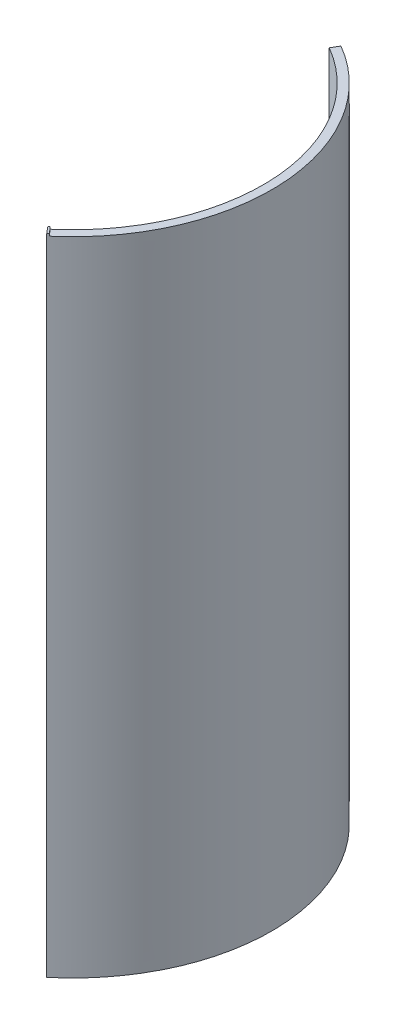
ISO-10303-21;
HEADER;
FILE_DESCRIPTION(('STEP AP214'),'2;1');
FILE_NAME('part.step','',(''),(''),'','','');
FILE_SCHEMA(('AUTOMOTIVE_DESIGN { 1 0 10303 214 1 1 1 1 }'));
ENDSEC;
DATA;
#1=APPLICATION_CONTEXT('core data for automotive mechanical design processes');
#2=APPLICATION_PROTOCOL_DEFINITION('international standard','automotive_design',2000,#1);
#3=PRODUCT_CONTEXT('',#1,'mechanical');
#4=PRODUCT('Part','Part','',(#3));
#5=PRODUCT_RELATED_PRODUCT_CATEGORY('part','',(#4));
#6=PRODUCT_DEFINITION_FORMATION('','',#4);
#7=PRODUCT_DEFINITION_CONTEXT('part definition',#1,'design');
#8=PRODUCT_DEFINITION('design','',#6,#7);
#9=PRODUCT_DEFINITION_SHAPE('','',#8);
#10=(LENGTH_UNIT() NAMED_UNIT(*) SI_UNIT(.MILLI.,.METRE.));
#11=(NAMED_UNIT(*) PLANE_ANGLE_UNIT() SI_UNIT($,.RADIAN.));
#12=(NAMED_UNIT(*) SI_UNIT($,.STERADIAN.) SOLID_ANGLE_UNIT());
#13=UNCERTAINTY_MEASURE_WITH_UNIT(LENGTH_MEASURE(1.E-05),#10,'distance_accuracy_value','');
#14=(GEOMETRIC_REPRESENTATION_CONTEXT(3) GLOBAL_UNCERTAINTY_ASSIGNED_CONTEXT((#13)) GLOBAL_UNIT_ASSIGNED_CONTEXT((#10,
#11,#12)) REPRESENTATION_CONTEXT('',''));
#15=CARTESIAN_POINT('',(0.,0.,0.));
#16=DIRECTION('',(0.,0.,1.));
#17=DIRECTION('',(1.,0.,0.));
#18=AXIS2_PLACEMENT_3D('',#15,#16,#17);
#19=CARTESIAN_POINT('',(0.,150.,0.));
#20=DIRECTION('',(0.,1.,0.));
#21=DIRECTION('',(0.,0.,1.));
#22=AXIS2_PLACEMENT_3D('',#19,#20,#21);
#23=PLANE('',#22);
#24=CARTESIAN_POINT('',(-19.0918830920365,150.,19.091883092037));
#25=CARTESIAN_POINT('',(-20.3463734071662,150.,18.1596419610419));
#26=CARTESIAN_POINT('',(-21.5345002593324,150.,17.1054336194398));
#27=CARTESIAN_POINT('',(-23.7328713875834,150.,14.7754464788285));
#28=CARTESIAN_POINT('',(-24.7430621891248,150.,13.4996862563432));
#29=CARTESIAN_POINT('',(-26.5442053629252,150.,10.7573847474911));
#30=CARTESIAN_POINT('',(-27.3351077383595,150.,9.2908719326232));
#31=CARTESIAN_POINT('',(-28.6617875844582,150.,6.20555601535264));
#32=CARTESIAN_POINT('',(-29.1975203590944,150.,4.58679060706874));
#33=CARTESIAN_POINT('',(-29.9848713551927,150.,1.24216620690554));
#34=CARTESIAN_POINT('',(-30.2364518716301,150.,-0.483646874587807));
#35=CARTESIAN_POINT('',(-30.4346480202212,150.,-3.99172231877559));
#36=CARTESIAN_POINT('',(-30.3812344349058,150.,-5.7739318685841));
#37=CARTESIAN_POINT('',(-29.9577408614613,150.,-9.34019463446037));
#38=CARTESIAN_POINT('',(-29.5876413908746,150.,-11.124189718761));
#39=CARTESIAN_POINT('',(-28.5289584697478,150.,-14.6371272504462));
#40=CARTESIAN_POINT('',(-27.8403662219906,150.,-16.3660080531824));
#41=CARTESIAN_POINT('',(-26.1531917269064,150.,-19.7113339535273));
#42=CARTESIAN_POINT('',(-25.1546119815376,150.,-21.3277158660333));
#43=CARTESIAN_POINT('',(-22.8663645263466,150.,-24.392054471337));
#44=CARTESIAN_POINT('',(-21.5767108667712,150.,-25.8399485147219));
#45=CARTESIAN_POINT('',(-18.7353780044284,150.,-28.5146111546944));
#46=CARTESIAN_POINT('',(-17.1837242676492,150.,-29.741319749938));
#47=CARTESIAN_POINT('',(-13.857020421084,150.,-31.9260486068176));
#48=CARTESIAN_POINT('',(-12.082006674444,150.,-32.8840135937121));
#49=CARTESIAN_POINT('',(-8.35584888350383,150.,-34.4905669189334));
#50=CARTESIAN_POINT('',(-6.40475120334752,150.,-35.1391066834268));
#51=CARTESIAN_POINT('',(-2.3810837423971,150.,-36.0945611631227));
#52=CARTESIAN_POINT('',(-0.308569074256293,150.,-36.401435807134));
#53=CARTESIAN_POINT('',(3.89740944185919,150.,-36.6510881068724));
#54=CARTESIAN_POINT('',(6.03081100392669,150.,-36.5938357592237));
#55=CARTESIAN_POINT('',(10.293943116198,150.,-36.1035956015378));
#56=CARTESIAN_POINT('',(12.4236060602799,150.,-35.6705891271213));
#57=CARTESIAN_POINT('',(16.6124993704204,150.,-34.428770402173));
#58=CARTESIAN_POINT('',(18.6716588858423,150.,-33.6199517546004));
#59=CARTESIAN_POINT('',(22.6527275815298,150.,-31.6383857424615));
#60=CARTESIAN_POINT('',(24.5745649013814,150.,-30.4656447952092));
#61=CARTESIAN_POINT('',(28.2162648147952,150.,-27.7800600744914));
#62=CARTESIAN_POINT('',(29.9360568617656,150.,-26.2672356717173));
#63=CARTESIAN_POINT('',(33.1131804789648,150.,-22.9368720843294));
#64=CARTESIAN_POINT('',(34.5704451543527,150.,-21.1193649410629));
#65=CARTESIAN_POINT('',(37.1683376924833,150.,-17.2258133701277));
#66=CARTESIAN_POINT('',(38.3089045878775,150.,-15.1498129498514));
#67=CARTESIAN_POINT('',(40.2274614116415,150.,-10.7950978751735));
#68=CARTESIAN_POINT('',(41.0053984376901,150.,-8.51643808142414));
#69=CARTESIAN_POINT('',(42.1627078141924,150.,-3.8203850911441));
#70=CARTESIAN_POINT('',(42.5420372536601,150.,-1.40305611494272));
#71=CARTESIAN_POINT('',(42.8775407157179,150.,3.49998905521581));
#72=CARTESIAN_POINT('',(42.8336834661649,150.,5.98563350315395));
#73=CARTESIAN_POINT('',(42.3107386888407,150.,10.9506450768701));
#74=CARTESIAN_POINT('',(41.8316328366593,150.,13.4299350530076));
#75=CARTESIAN_POINT('',(40.4393806043387,150.,18.3054968014477));
#76=CARTESIAN_POINT('',(39.5262297678277,150.,20.701688367873));
#77=CARTESIAN_POINT('',(37.280686855791,150.,25.3346058035535));
#78=CARTESIAN_POINT('',(35.9483046853433,150.,27.5712509120478));
#79=CARTESIAN_POINT('',(32.8926277115008,150.,31.8113457555537));
#80=CARTESIAN_POINT('',(31.1693572159586,150.,33.814716752477));
#81=CARTESIAN_POINT('',(27.3732480382687,150.,37.5196541469023));
#82=CARTESIAN_POINT('',(25.3004476449646,150.,39.2211464009758));
#83=CARTESIAN_POINT('',(20.8586979039303,150.,42.2611408054309));
#84=CARTESIAN_POINT('',(18.489799944907,150.,43.5995758902647));
#85=CARTESIAN_POINT('',(13.5200000313143,150.,45.8618219281404));
#86=CARTESIAN_POINT('',(10.9191612435361,150.,46.7855752060155));
#87=CARTESIAN_POINT('',(5.55862642549506,150.,48.1782550607997));
#88=CARTESIAN_POINT('',(2.79900361096261,150.,48.6471354166666));
#89=CARTESIAN_POINT('',(5.80617015949208E-13,150.,48.875));
#90=B_SPLINE_CURVE_WITH_KNOTS('',3,(#24,#25,#26,#27,#28,#29,#30,#31,#32,#33,#34,#35,#36,#37,#38,
#39,#40,#41,#42,#43,#44,#45,#46,#47,#48,#49,#50,#51,#52,#53,#54,#55,#56,#57,#58,#59,#60,#61,#62,
#63,#64,#65,#66,#67,#68,#69,#70,#71,#72,#73,#74,#75,#76,#77,#78,#79,#80,#81,#82,#83,#84,#85,#86,
#87,#88,#89),.UNSPECIFIED.,.F.,.F.,(4,2,2,2,2,2,2,2,2,2,2,2,2,2,2,2,2,2,2,2,2,2,2,2,2,2,2,2,2,2,
2,2,4),(0.,0.03125,0.0625,0.09375,0.125,0.15625,0.1875,0.21875,0.25,0.28125,0.3125,0.34375,
0.375,0.40625,0.4375,0.46875,0.5,0.53125,0.5625,0.59375,0.625,0.65625,0.6875,0.71875,0.75,
0.78125,0.8125,0.84375,0.875,0.90625,0.9375,0.96875,1.),.UNSPECIFIED.);
#91=CARTESIAN_POINT('',(22.7951421509959,150.,-31.4823443712795));
#92=VERTEX_POINT('',#91);
#93=CARTESIAN_POINT('',(26.9108133537189,150.,37.8162802669883));
#94=VERTEX_POINT('',#93);
#95=EDGE_CURVE('E98',#92,#94,#90,.T.);
#96=ORIENTED_EDGE('',*,*,#95,.T.);
#97=DIRECTION('',(0.647266097432394,0.,0.762264126871152));
#98=VECTOR('',#97,1.);
#99=CARTESIAN_POINT('',(-3.02165196939426,150.,2.56579420319399));
#100=LINE('',#99,#98);
#101=CARTESIAN_POINT('',(28.2053437399523,150.,39.3408063897618));
#102=VERTEX_POINT('',#101);
#103=EDGE_CURVE('E150',#94,#102,#100,.T.);
#104=ORIENTED_EDGE('',*,*,#103,.T.);
#105=CARTESIAN_POINT('',(-20.284806523139,150.,20.6971661473038));
#106=CARTESIAN_POINT('',(-21.6469349481276,150.,19.6849366161888));
#107=CARTESIAN_POINT('',(-24.1784754805348,150.,17.4351949136638));
#108=CARTESIAN_POINT('',(-28.5208644332071,150.,11.9579130722896));
#109=CARTESIAN_POINT('',(-32.149460613473,150.,3.60016921433298));
#110=CARTESIAN_POINT('',(-32.8348971371941,150.,-7.79353696689876));
#111=CARTESIAN_POINT('',(-29.4441518585612,150.,-19.1834580933702));
#112=CARTESIAN_POINT('',(-22.083640026458,150.,-29.1083698958214));
#113=CARTESIAN_POINT('',(-11.3826925533388,150.,-36.1844244603167));
#114=CARTESIAN_POINT('',(1.54976707172065,150.,-39.2970781470818));
#115=CARTESIAN_POINT('',(12.6426134399102,150.,-38.0545824427317));
#116=CARTESIAN_POINT('',(21.0330101055813,150.,-34.8691158336497));
#117=CARTESIAN_POINT('',(25.8635920265152,150.,-32.0782118074364));
#118=CARTESIAN_POINT('',(31.7987175405846,150.,-27.5199922653745));
#119=CARTESIAN_POINT('',(38.5761747844764,150.,-19.9889857519648));
#120=CARTESIAN_POINT('',(44.3682365957182,150.,-6.93710584227973));
#121=CARTESIAN_POINT('',(45.47844188482,150.,8.69346017968454));
#122=CARTESIAN_POINT('',(41.1214865583818,150.,24.1009158161417));
#123=CARTESIAN_POINT('',(34.3866469932016,150.,33.572491638163));
#124=CARTESIAN_POINT('',(28.9639981767198,150.,38.7297170698156));
#125=CARTESIAN_POINT('',(26.7177475938299,150.,40.6040404994617));
#126=CARTESIAN_POINT('',(22.6325811313915,150.,43.5587447934556));
#127=CARTESIAN_POINT('',(16.9541486744139,150.,46.7674378513083));
#128=CARTESIAN_POINT('',(10.1772840934641,150.,49.1736497511526));
#129=CARTESIAN_POINT('',(4.51546868359988,150.,50.3869026675537));
#130=CARTESIAN_POINT('',(1.61391719776806,150.,50.7502288372064));
#131=CARTESIAN_POINT('',(0.162281487584782,150.,50.8684053072036));
#132=B_SPLINE_CURVE_WITH_KNOTS('',3,(#105,#106,#107,#108,#109,#110,#111,#112,#113,#114,#115,
#116,#117,#118,#119,#120,#121,#122,#123,#124,#125,#126,#127,#128,#129,#130,#131),.UNSPECIFIED.,
.F.,.F.,(4,1,1,1,1,1,1,1,1,1,1,1,1,1,1,1,1,1,1,1,1,1,1,1,4),(0.,0.03125,0.0625,0.125,0.1875,
0.25,0.3125,0.375,0.4375,0.5,0.52693624887306,0.55818624887306,0.57381124887306,0.625,0.6875,
0.75,0.8125,0.873453421607825,0.881265921607825,0.896890921607825,0.90625,0.9375,0.96875,
0.984375,1.),.UNSPECIFIED.);
#133=CARTESIAN_POINT('',(23.7970623207433,150.,-33.2132851482714));
#134=VERTEX_POINT('',#133);
#135=EDGE_CURVE('E108',#134,#102,#132,.T.);
#136=ORIENTED_EDGE('',*,*,#135,.F.);
#137=DIRECTION('',(0.500960084873706,0.,-0.865470388495949));
#138=VECTOR('',#137,1.);
#139=CARTESIAN_POINT('',(3.4247724555705,150.,1.98236048606735));
#140=LINE('',#139,#138);
#141=EDGE_CURVE('E146',#92,#134,#140,.T.);
#142=ORIENTED_EDGE('',*,*,#141,.F.);
#143=EDGE_LOOP('',(#96,#104,#136,#142));
#144=FACE_BOUND('',#143,.T.);
#145=ADVANCED_FACE('F41',(#144),#23,.T.);
#146=DIRECTION('',(0.,-1.,0.));
#147=VECTOR('',#146,1.);
#148=SURFACE_OF_LINEAR_EXTRUSION('',#132,#147);
#149=CARTESIAN_POINT('',(-20.284806523139,0.,20.6971661473038));
#150=CARTESIAN_POINT('',(-21.6469349481276,0.,19.6849366161888));
#151=CARTESIAN_POINT('',(-24.1784754805348,0.,17.4351949136638));
#152=CARTESIAN_POINT('',(-28.5208644332071,0.,11.9579130722896));
#153=CARTESIAN_POINT('',(-32.149460613473,0.,3.60016921433298));
#154=CARTESIAN_POINT('',(-32.8348971371941,0.,-7.79353696689876));
#155=CARTESIAN_POINT('',(-29.4441518585612,0.,-19.1834580933702));
#156=CARTESIAN_POINT('',(-22.083640026458,0.,-29.1083698958214));
#157=CARTESIAN_POINT('',(-11.3826925533388,0.,-36.1844244603167));
#158=CARTESIAN_POINT('',(1.54976707172065,0.,-39.2970781470818));
#159=CARTESIAN_POINT('',(12.6426134399102,0.,-38.0545824427317));
#160=CARTESIAN_POINT('',(21.0330101055813,0.,-34.8691158336497));
#161=CARTESIAN_POINT('',(25.8635920265152,0.,-32.0782118074364));
#162=CARTESIAN_POINT('',(31.7987175405846,0.,-27.5199922653745));
#163=CARTESIAN_POINT('',(38.5761747844764,0.,-19.9889857519648));
#164=CARTESIAN_POINT('',(44.3682365957182,0.,-6.93710584227973));
#165=CARTESIAN_POINT('',(45.47844188482,0.,8.69346017968454));
#166=CARTESIAN_POINT('',(41.1214865583818,0.,24.1009158161417));
#167=CARTESIAN_POINT('',(34.3866469932016,0.,33.572491638163));
#168=CARTESIAN_POINT('',(28.9639981767198,0.,38.7297170698156));
#169=CARTESIAN_POINT('',(26.7177475938299,0.,40.6040404994617));
#170=CARTESIAN_POINT('',(22.6325811313915,0.,43.5587447934556));
#171=CARTESIAN_POINT('',(16.9541486744139,0.,46.7674378513083));
#172=CARTESIAN_POINT('',(10.1772840934641,0.,49.1736497511526));
#173=CARTESIAN_POINT('',(4.51546868359988,0.,50.3869026675537));
#174=CARTESIAN_POINT('',(1.61391719776806,0.,50.7502288372064));
#175=CARTESIAN_POINT('',(0.162281487584782,0.,50.8684053072036));
#176=B_SPLINE_CURVE_WITH_KNOTS('',3,(#149,#150,#151,#152,#153,#154,#155,#156,#157,#158,#159,
#160,#161,#162,#163,#164,#165,#166,#167,#168,#169,#170,#171,#172,#173,#174,#175),.UNSPECIFIED.,
.F.,.F.,(4,1,1,1,1,1,1,1,1,1,1,1,1,1,1,1,1,1,1,1,1,1,1,1,4),(0.,0.03125,0.0625,0.125,0.1875,
0.25,0.3125,0.375,0.4375,0.5,0.52693624887306,0.55818624887306,0.57381124887306,0.625,0.6875,
0.75,0.8125,0.873453421607825,0.881265921607825,0.896890921607825,0.90625,0.9375,0.96875,
0.984375,1.),.UNSPECIFIED.);
#177=CARTESIAN_POINT('',(23.7970623207433,0.,-33.2132851482714));
#178=VERTEX_POINT('',#177);
#179=CARTESIAN_POINT('',(27.8832469494637,0.,39.6119001683923));
#180=VERTEX_POINT('',#179);
#181=EDGE_CURVE('E88',#178,#180,#176,.T.);
#182=ORIENTED_EDGE('',*,*,#181,.F.);
#183=DIRECTION('',(0.,-1.,0.));
#184=VECTOR('',#183,1.);
#185=CARTESIAN_POINT('',(23.7970623207433,150.,-33.2132851482714));
#186=LINE('',#185,#184);
#187=EDGE_CURVE('E11',#134,#178,#186,.T.);
#188=ORIENTED_EDGE('',*,*,#187,.F.);
#189=ORIENTED_EDGE('',*,*,#135,.T.);
#190=DIRECTION('',(0.,-1.,0.));
#191=VECTOR('',#190,1.);
#192=CARTESIAN_POINT('',(28.2053437399522,150.5,39.3408063897618));
#193=LINE('',#192,#191);
#194=CARTESIAN_POINT('',(28.2053437399522,150.5,39.3408063897618));
#195=VERTEX_POINT('',#194);
#196=EDGE_CURVE('E58',#195,#102,#193,.T.);
#197=ORIENTED_EDGE('',*,*,#196,.F.);
#198=CARTESIAN_POINT('',(0.162281487584782,150.5,50.8684053072036));
#199=CARTESIAN_POINT('',(1.61391719776806,150.5,50.7502288372064));
#200=CARTESIAN_POINT('',(4.51546868359988,150.5,50.3869026675537));
#201=CARTESIAN_POINT('',(10.1772840934641,150.5,49.1736497511526));
#202=CARTESIAN_POINT('',(16.9541486744139,150.5,46.7674378513083));
#203=CARTESIAN_POINT('',(22.6325811313915,150.5,43.5587447934556));
#204=CARTESIAN_POINT('',(26.7177475938299,150.5,40.6040404994617));
#205=CARTESIAN_POINT('',(28.9639981767198,150.5,38.7297170698156));
#206=CARTESIAN_POINT('',(34.3866469932016,150.5,33.572491638163));
#207=CARTESIAN_POINT('',(41.1214865583818,150.5,24.1009158161417));
#208=CARTESIAN_POINT('',(45.47844188482,150.5,8.69346017968454));
#209=CARTESIAN_POINT('',(44.3682365957182,150.5,-6.93710584227973));
#210=CARTESIAN_POINT('',(38.5761747844764,150.5,-19.9889857519648));
#211=CARTESIAN_POINT('',(31.7987175405846,150.5,-27.5199922653745));
#212=CARTESIAN_POINT('',(25.8635920265152,150.5,-32.0782118074364));
#213=CARTESIAN_POINT('',(21.0330101055813,150.5,-34.8691158336497));
#214=CARTESIAN_POINT('',(12.6426134399102,150.5,-38.0545824427317));
#215=CARTESIAN_POINT('',(1.54976707172065,150.5,-39.2970781470818));
#216=CARTESIAN_POINT('',(-11.3826925533388,150.5,-36.1844244603167));
#217=CARTESIAN_POINT('',(-22.083640026458,150.5,-29.1083698958214));
#218=CARTESIAN_POINT('',(-29.4441518585612,150.5,-19.1834580933702));
#219=CARTESIAN_POINT('',(-32.8348971371941,150.5,-7.79353696689876));
#220=CARTESIAN_POINT('',(-32.149460613473,150.5,3.60016921433298));
#221=CARTESIAN_POINT('',(-28.5208644332071,150.5,11.9579130722896));
#222=CARTESIAN_POINT('',(-24.1784754805348,150.5,17.4351949136638));
#223=CARTESIAN_POINT('',(-21.6469349481276,150.5,19.6849366161888));
#224=CARTESIAN_POINT('',(-20.284806523139,150.5,20.6971661473038));
#225=B_SPLINE_CURVE_WITH_KNOTS('',3,(#198,#199,#200,#201,#202,#203,#204,#205,#206,#207,#208,
#209,#210,#211,#212,#213,#214,#215,#216,#217,#218,#219,#220,#221,#222,#223,#224),.UNSPECIFIED.,
.F.,.F.,(4,1,1,1,1,1,1,1,1,1,1,1,1,1,1,1,1,1,1,1,1,1,1,1,4),(0.,0.015625,0.03125,0.0625,0.09375,
0.103109078392175,0.118734078392175,0.126546578392175,0.1875,0.25,0.3125,0.375,0.42618875112694,
0.44181375112694,0.47306375112694,0.5,0.5625,0.625,0.6875,0.75,0.8125,0.875,0.9375,0.96875,1.),.UNSPECIFIED.);
#226=CARTESIAN_POINT('',(27.8832469494637,150.5,39.6119001683923));
#227=VERTEX_POINT('',#226);
#228=EDGE_CURVE('E92',#227,#195,#225,.T.);
#229=ORIENTED_EDGE('',*,*,#228,.F.);
#230=DIRECTION('',(0.,-1.,0.));
#231=VECTOR('',#230,1.);
#232=CARTESIAN_POINT('',(27.8832469494637,150.,39.6119001683923));
#233=LINE('',#232,#231);
#234=EDGE_CURVE('E85',#227,#180,#233,.T.);
#235=ORIENTED_EDGE('',*,*,#234,.T.);
#236=EDGE_LOOP('',(#182,#188,#189,#197,#229,#235));
#237=FACE_BOUND('',#236,.T.);
#238=ADVANCED_FACE('F43',(#237),#148,.T.);
#239=CARTESIAN_POINT('',(3.4247724555705,150.,1.98236048606735));
#240=DIRECTION('',(-0.865470388495949,0.,-0.500960084873706));
#241=DIRECTION('',(-0.500960084873706,0.,0.865470388495949));
#242=AXIS2_PLACEMENT_3D('',#239,#240,#241);
#243=PLANE('',#242);
#244=DIRECTION('',(0.500960084873706,0.,-0.865470388495949));
#245=VECTOR('',#244,1.);
#246=CARTESIAN_POINT('',(3.4247724555705,0.,1.98236048606735));
#247=LINE('',#246,#245);
#248=CARTESIAN_POINT('',(22.7951421509959,0.,-31.4823443712795));
#249=VERTEX_POINT('',#248);
#250=EDGE_CURVE('E112',#249,#178,#247,.T.);
#251=ORIENTED_EDGE('',*,*,#250,.F.);
#252=DIRECTION('',(0.,-1.,0.));
#253=VECTOR('',#252,1.);
#254=CARTESIAN_POINT('',(22.7951421509959,150.,-31.4823443712795));
#255=LINE('',#254,#253);
#256=EDGE_CURVE('E51',#92,#249,#255,.T.);
#257=ORIENTED_EDGE('',*,*,#256,.F.);
#258=ORIENTED_EDGE('',*,*,#141,.T.);
#259=ORIENTED_EDGE('',*,*,#187,.T.);
#260=EDGE_LOOP('',(#251,#257,#258,#259));
#261=FACE_BOUND('',#260,.T.);
#262=ADVANCED_FACE('F145',(#261),#243,.T.);
#263=DIRECTION('',(0.,-1.,0.));
#264=VECTOR('',#263,1.);
#265=SURFACE_OF_LINEAR_EXTRUSION('',#90,#264);
#266=CARTESIAN_POINT('',(-19.0918830920365,0.,19.091883092037));
#267=CARTESIAN_POINT('',(-20.3463734071662,0.,18.1596419610419));
#268=CARTESIAN_POINT('',(-21.5345002593324,0.,17.1054336194398));
#269=CARTESIAN_POINT('',(-23.7328713875834,0.,14.7754464788285));
#270=CARTESIAN_POINT('',(-24.7430621891248,0.,13.4996862563432));
#271=CARTESIAN_POINT('',(-26.5442053629252,0.,10.7573847474911));
#272=CARTESIAN_POINT('',(-27.3351077383595,0.,9.2908719326232));
#273=CARTESIAN_POINT('',(-28.6617875844582,0.,6.20555601535264));
#274=CARTESIAN_POINT('',(-29.1975203590944,0.,4.58679060706874));
#275=CARTESIAN_POINT('',(-29.9848713551927,0.,1.24216620690554));
#276=CARTESIAN_POINT('',(-30.2364518716301,0.,-0.483646874587807));
#277=CARTESIAN_POINT('',(-30.4346480202212,0.,-3.99172231877559));
#278=CARTESIAN_POINT('',(-30.3812344349058,0.,-5.7739318685841));
#279=CARTESIAN_POINT('',(-29.9577408614613,0.,-9.34019463446037));
#280=CARTESIAN_POINT('',(-29.5876413908746,0.,-11.124189718761));
#281=CARTESIAN_POINT('',(-28.5289584697478,0.,-14.6371272504462));
#282=CARTESIAN_POINT('',(-27.8403662219906,0.,-16.3660080531824));
#283=CARTESIAN_POINT('',(-26.1531917269064,0.,-19.7113339535273));
#284=CARTESIAN_POINT('',(-25.1546119815376,0.,-21.3277158660333));
#285=CARTESIAN_POINT('',(-22.8663645263466,0.,-24.392054471337));
#286=CARTESIAN_POINT('',(-21.5767108667712,0.,-25.8399485147219));
#287=CARTESIAN_POINT('',(-18.7353780044284,0.,-28.5146111546944));
#288=CARTESIAN_POINT('',(-17.1837242676492,0.,-29.741319749938));
#289=CARTESIAN_POINT('',(-13.857020421084,0.,-31.9260486068176));
#290=CARTESIAN_POINT('',(-12.082006674444,0.,-32.8840135937121));
#291=CARTESIAN_POINT('',(-8.35584888350383,0.,-34.4905669189334));
#292=CARTESIAN_POINT('',(-6.40475120334752,0.,-35.1391066834268));
#293=CARTESIAN_POINT('',(-2.3810837423971,0.,-36.0945611631227));
#294=CARTESIAN_POINT('',(-0.308569074256293,0.,-36.401435807134));
#295=CARTESIAN_POINT('',(3.89740944185919,0.,-36.6510881068724));
#296=CARTESIAN_POINT('',(6.03081100392669,0.,-36.5938357592237));
#297=CARTESIAN_POINT('',(10.293943116198,0.,-36.1035956015378));
#298=CARTESIAN_POINT('',(12.4236060602799,0.,-35.6705891271213));
#299=CARTESIAN_POINT('',(16.6124993704204,0.,-34.428770402173));
#300=CARTESIAN_POINT('',(18.6716588858423,0.,-33.6199517546004));
#301=CARTESIAN_POINT('',(22.6527275815298,0.,-31.6383857424615));
#302=CARTESIAN_POINT('',(24.5745649013814,0.,-30.4656447952092));
#303=CARTESIAN_POINT('',(28.2162648147952,0.,-27.7800600744914));
#304=CARTESIAN_POINT('',(29.9360568617656,0.,-26.2672356717173));
#305=CARTESIAN_POINT('',(33.1131804789648,0.,-22.9368720843294));
#306=CARTESIAN_POINT('',(34.5704451543527,0.,-21.1193649410629));
#307=CARTESIAN_POINT('',(37.1683376924833,0.,-17.2258133701277));
#308=CARTESIAN_POINT('',(38.3089045878775,0.,-15.1498129498514));
#309=CARTESIAN_POINT('',(40.2274614116415,0.,-10.7950978751735));
#310=CARTESIAN_POINT('',(41.0053984376901,0.,-8.51643808142414));
#311=CARTESIAN_POINT('',(42.1627078141924,0.,-3.8203850911441));
#312=CARTESIAN_POINT('',(42.5420372536601,0.,-1.40305611494272));
#313=CARTESIAN_POINT('',(42.8775407157179,0.,3.49998905521581));
#314=CARTESIAN_POINT('',(42.8336834661649,0.,5.98563350315395));
#315=CARTESIAN_POINT('',(42.3107386888407,0.,10.9506450768701));
#316=CARTESIAN_POINT('',(41.8316328366593,0.,13.4299350530076));
#317=CARTESIAN_POINT('',(40.4393806043387,0.,18.3054968014477));
#318=CARTESIAN_POINT('',(39.5262297678277,0.,20.701688367873));
#319=CARTESIAN_POINT('',(37.280686855791,0.,25.3346058035535));
#320=CARTESIAN_POINT('',(35.9483046853433,0.,27.5712509120478));
#321=CARTESIAN_POINT('',(32.8926277115008,0.,31.8113457555537));
#322=CARTESIAN_POINT('',(31.1693572159586,0.,33.814716752477));
#323=CARTESIAN_POINT('',(27.3732480382687,0.,37.5196541469023));
#324=CARTESIAN_POINT('',(25.3004476449646,0.,39.2211464009758));
#325=CARTESIAN_POINT('',(20.8586979039303,0.,42.2611408054309));
#326=CARTESIAN_POINT('',(18.489799944907,0.,43.5995758902647));
#327=CARTESIAN_POINT('',(13.5200000313143,0.,45.8618219281404));
#328=CARTESIAN_POINT('',(10.9191612435361,0.,46.7855752060155));
#329=CARTESIAN_POINT('',(5.55862642549506,0.,48.1782550607997));
#330=CARTESIAN_POINT('',(2.79900361096261,0.,48.6471354166666));
#331=CARTESIAN_POINT('',(5.80617015949208E-13,0.,48.875));
#332=B_SPLINE_CURVE_WITH_KNOTS('',3,(#266,#267,#268,#269,#270,#271,#272,#273,#274,#275,#276,
#277,#278,#279,#280,#281,#282,#283,#284,#285,#286,#287,#288,#289,#290,#291,#292,#293,#294,#295,
#296,#297,#298,#299,#300,#301,#302,#303,#304,#305,#306,#307,#308,#309,#310,#311,#312,#313,#314,
#315,#316,#317,#318,#319,#320,#321,#322,#323,#324,#325,#326,#327,#328,#329,#330,#331),
.UNSPECIFIED.,.F.,.F.,(4,2,2,2,2,2,2,2,2,2,2,2,2,2,2,2,2,2,2,2,2,2,2,2,2,2,2,2,2,2,2,2,4),(0.,
0.03125,0.0625,0.09375,0.125,0.15625,0.1875,0.21875,0.25,0.28125,0.3125,0.34375,0.375,0.40625,
0.4375,0.46875,0.5,0.53125,0.5625,0.59375,0.625,0.65625,0.6875,0.71875,0.75,0.78125,0.8125,
0.84375,0.875,0.90625,0.9375,0.96875,1.),.UNSPECIFIED.);
#333=CARTESIAN_POINT('',(26.6020678963428,0.,38.0761331828622));
#334=VERTEX_POINT('',#333);
#335=EDGE_CURVE('E109',#249,#334,#332,.T.);
#336=ORIENTED_EDGE('',*,*,#335,.T.);
#337=DIRECTION('',(0.,-1.,0.));
#338=VECTOR('',#337,1.);
#339=CARTESIAN_POINT('',(26.6020678963428,150.,38.0761331828622));
#340=LINE('',#339,#338);
#341=CARTESIAN_POINT('',(26.6020678963428,150.5,38.0761331828622));
#342=VERTEX_POINT('',#341);
#343=EDGE_CURVE('E97',#342,#334,#340,.T.);
#344=ORIENTED_EDGE('',*,*,#343,.F.);
#345=CARTESIAN_POINT('',(-19.0918830920365,150.5,19.091883092037));
#346=CARTESIAN_POINT('',(-20.3463734071662,150.5,18.1596419610419));
#347=CARTESIAN_POINT('',(-21.5345002593324,150.5,17.1054336194398));
#348=CARTESIAN_POINT('',(-23.7328713875834,150.5,14.7754464788285));
#349=CARTESIAN_POINT('',(-24.7430621891248,150.5,13.4996862563432));
#350=CARTESIAN_POINT('',(-26.5442053629252,150.5,10.7573847474911));
#351=CARTESIAN_POINT('',(-27.3351077383595,150.5,9.2908719326232));
#352=CARTESIAN_POINT('',(-28.6617875844582,150.5,6.20555601535264));
#353=CARTESIAN_POINT('',(-29.1975203590944,150.5,4.58679060706874));
#354=CARTESIAN_POINT('',(-29.9848713551927,150.5,1.24216620690554));
#355=CARTESIAN_POINT('',(-30.2364518716301,150.5,-0.483646874587807));
#356=CARTESIAN_POINT('',(-30.4346480202212,150.5,-3.99172231877559));
#357=CARTESIAN_POINT('',(-30.3812344349058,150.5,-5.7739318685841));
#358=CARTESIAN_POINT('',(-29.9577408614613,150.5,-9.34019463446037));
#359=CARTESIAN_POINT('',(-29.5876413908746,150.5,-11.124189718761));
#360=CARTESIAN_POINT('',(-28.5289584697478,150.5,-14.6371272504462));
#361=CARTESIAN_POINT('',(-27.8403662219906,150.5,-16.3660080531824));
#362=CARTESIAN_POINT('',(-26.1531917269064,150.5,-19.7113339535273));
#363=CARTESIAN_POINT('',(-25.1546119815376,150.5,-21.3277158660333));
#364=CARTESIAN_POINT('',(-22.8663645263466,150.5,-24.392054471337));
#365=CARTESIAN_POINT('',(-21.5767108667712,150.5,-25.8399485147219));
#366=CARTESIAN_POINT('',(-18.7353780044284,150.5,-28.5146111546944));
#367=CARTESIAN_POINT('',(-17.1837242676492,150.5,-29.741319749938));
#368=CARTESIAN_POINT('',(-13.857020421084,150.5,-31.9260486068176));
#369=CARTESIAN_POINT('',(-12.082006674444,150.5,-32.8840135937121));
#370=CARTESIAN_POINT('',(-8.35584888350383,150.5,-34.4905669189334));
#371=CARTESIAN_POINT('',(-6.40475120334752,150.5,-35.1391066834268));
#372=CARTESIAN_POINT('',(-2.3810837423971,150.5,-36.0945611631227));
#373=CARTESIAN_POINT('',(-0.308569074256293,150.5,-36.401435807134));
#374=CARTESIAN_POINT('',(3.89740944185919,150.5,-36.6510881068724));
#375=CARTESIAN_POINT('',(6.03081100392669,150.5,-36.5938357592237));
#376=CARTESIAN_POINT('',(10.293943116198,150.5,-36.1035956015378));
#377=CARTESIAN_POINT('',(12.4236060602799,150.5,-35.6705891271213));
#378=CARTESIAN_POINT('',(16.6124993704204,150.5,-34.428770402173));
#379=CARTESIAN_POINT('',(18.6716588858423,150.5,-33.6199517546004));
#380=CARTESIAN_POINT('',(22.6527275815298,150.5,-31.6383857424615));
#381=CARTESIAN_POINT('',(24.5745649013814,150.5,-30.4656447952092));
#382=CARTESIAN_POINT('',(28.2162648147952,150.5,-27.7800600744914));
#383=CARTESIAN_POINT('',(29.9360568617656,150.5,-26.2672356717173));
#384=CARTESIAN_POINT('',(33.1131804789648,150.5,-22.9368720843294));
#385=CARTESIAN_POINT('',(34.5704451543527,150.5,-21.1193649410629));
#386=CARTESIAN_POINT('',(37.1683376924833,150.5,-17.2258133701277));
#387=CARTESIAN_POINT('',(38.3089045878775,150.5,-15.1498129498514));
#388=CARTESIAN_POINT('',(40.2274614116415,150.5,-10.7950978751735));
#389=CARTESIAN_POINT('',(41.0053984376901,150.5,-8.51643808142414));
#390=CARTESIAN_POINT('',(42.1627078141924,150.5,-3.8203850911441));
#391=CARTESIAN_POINT('',(42.5420372536601,150.5,-1.40305611494272));
#392=CARTESIAN_POINT('',(42.8775407157179,150.5,3.49998905521581));
#393=CARTESIAN_POINT('',(42.8336834661649,150.5,5.98563350315395));
#394=CARTESIAN_POINT('',(42.3107386888407,150.5,10.9506450768701));
#395=CARTESIAN_POINT('',(41.8316328366593,150.5,13.4299350530076));
#396=CARTESIAN_POINT('',(40.4393806043387,150.5,18.3054968014477));
#397=CARTESIAN_POINT('',(39.5262297678277,150.5,20.701688367873));
#398=CARTESIAN_POINT('',(37.280686855791,150.5,25.3346058035535));
#399=CARTESIAN_POINT('',(35.9483046853433,150.5,27.5712509120478));
#400=CARTESIAN_POINT('',(32.8926277115008,150.5,31.8113457555537));
#401=CARTESIAN_POINT('',(31.1693572159586,150.5,33.814716752477));
#402=CARTESIAN_POINT('',(27.3732480382687,150.5,37.5196541469023));
#403=CARTESIAN_POINT('',(25.3004476449646,150.5,39.2211464009758));
#404=CARTESIAN_POINT('',(20.8586979039303,150.5,42.2611408054309));
#405=CARTESIAN_POINT('',(18.489799944907,150.5,43.5995758902647));
#406=CARTESIAN_POINT('',(13.5200000313143,150.5,45.8618219281404));
#407=CARTESIAN_POINT('',(10.9191612435361,150.5,46.7855752060155));
#408=CARTESIAN_POINT('',(5.55862642549506,150.5,48.1782550607997));
#409=CARTESIAN_POINT('',(2.79900361096261,150.5,48.6471354166666));
#410=CARTESIAN_POINT('',(5.80617015949208E-13,150.5,48.875));
#411=B_SPLINE_CURVE_WITH_KNOTS('',3,(#345,#346,#347,#348,#349,#350,#351,#352,#353,#354,#355,
#356,#357,#358,#359,#360,#361,#362,#363,#364,#365,#366,#367,#368,#369,#370,#371,#372,#373,#374,
#375,#376,#377,#378,#379,#380,#381,#382,#383,#384,#385,#386,#387,#388,#389,#390,#391,#392,#393,
#394,#395,#396,#397,#398,#399,#400,#401,#402,#403,#404,#405,#406,#407,#408,#409,#410),
.UNSPECIFIED.,.F.,.F.,(4,2,2,2,2,2,2,2,2,2,2,2,2,2,2,2,2,2,2,2,2,2,2,2,2,2,2,2,2,2,2,2,4),(0.,
0.03125,0.0625,0.09375,0.125,0.15625,0.1875,0.21875,0.25,0.28125,0.3125,0.34375,0.375,0.40625,
0.4375,0.46875,0.5,0.53125,0.5625,0.59375,0.625,0.65625,0.6875,0.71875,0.75,0.78125,0.8125,
0.84375,0.875,0.90625,0.9375,0.96875,1.),.UNSPECIFIED.);
#412=CARTESIAN_POINT('',(26.9108133537189,150.5,37.8162802669883));
#413=VERTEX_POINT('',#412);
#414=EDGE_CURVE('E175',#413,#342,#411,.T.);
#415=ORIENTED_EDGE('',*,*,#414,.F.);
#416=DIRECTION('',(0.,-1.,0.));
#417=VECTOR('',#416,1.);
#418=CARTESIAN_POINT('',(26.9108133537189,150.5,37.8162802669883));
#419=LINE('',#418,#417);
#420=EDGE_CURVE('E114',#413,#94,#419,.T.);
#421=ORIENTED_EDGE('',*,*,#420,.T.);
#422=ORIENTED_EDGE('',*,*,#95,.F.);
#423=ORIENTED_EDGE('',*,*,#256,.T.);
#424=EDGE_LOOP('',(#336,#344,#415,#421,#422,#423));
#425=FACE_BOUND('',#424,.T.);
#426=ADVANCED_FACE('F142',(#425),#265,.F.);
#427=CARTESIAN_POINT('',(-3.04380056702077,150.,2.53922213791994));
#428=DIRECTION('',(0.767883492765046,0.,-0.64058952656046));
#429=DIRECTION('',(-0.64058952656046,0.,-0.767883492765046));
#430=AXIS2_PLACEMENT_3D('',#427,#428,#429);
#431=PLANE('',#430);
#432=DIRECTION('',(0.64058952656046,0.,0.767883492765046));
#433=VECTOR('',#432,1.);
#434=CARTESIAN_POINT('',(-3.04380056702077,0.,2.53922213791994));
#435=LINE('',#434,#433);
#436=EDGE_CURVE('E102',#334,#180,#435,.T.);
#437=ORIENTED_EDGE('',*,*,#436,.T.);
#438=ORIENTED_EDGE('',*,*,#234,.F.);
#439=DIRECTION('',(0.64058952656046,0.,0.767883492765046));
#440=VECTOR('',#439,1.);
#441=CARTESIAN_POINT('',(-3.04380056702077,150.5,2.53922213791994));
#442=LINE('',#441,#440);
#443=EDGE_CURVE('E169',#342,#227,#442,.T.);
#444=ORIENTED_EDGE('',*,*,#443,.F.);
#445=ORIENTED_EDGE('',*,*,#343,.T.);
#446=EDGE_LOOP('',(#437,#438,#444,#445));
#447=FACE_BOUND('',#446,.T.);
#448=ADVANCED_FACE('F103',(#447),#431,.F.);
#449=CARTESIAN_POINT('',(0.,0.,0.));
#450=DIRECTION('',(0.,1.,0.));
#451=DIRECTION('',(0.,0.,1.));
#452=AXIS2_PLACEMENT_3D('',#449,#450,#451);
#453=PLANE('',#452);
#454=ORIENTED_EDGE('',*,*,#181,.T.);
#455=ORIENTED_EDGE('',*,*,#436,.F.);
#456=ORIENTED_EDGE('',*,*,#335,.F.);
#457=ORIENTED_EDGE('',*,*,#250,.T.);
#458=EDGE_LOOP('',(#454,#455,#456,#457));
#459=FACE_BOUND('',#458,.T.);
#460=ADVANCED_FACE('F111',(#459),#453,.F.);
#461=CARTESIAN_POINT('',(-3.02165196939426,150.5,2.56579420319399));
#462=DIRECTION('',(0.762264126871151,0.,-0.647266097432394));
#463=DIRECTION('',(-0.647266097432394,0.,-0.762264126871152));
#464=AXIS2_PLACEMENT_3D('',#461,#462,#463);
#465=PLANE('',#464);
#466=ORIENTED_EDGE('',*,*,#103,.F.);
#467=ORIENTED_EDGE('',*,*,#420,.F.);
#468=DIRECTION('',(0.647266097432394,0.,0.762264126871152));
#469=VECTOR('',#468,1.);
#470=CARTESIAN_POINT('',(-3.02165196939426,150.5,2.56579420319399));
#471=LINE('',#470,#469);
#472=EDGE_CURVE('E164',#413,#195,#471,.T.);
#473=ORIENTED_EDGE('',*,*,#472,.T.);
#474=ORIENTED_EDGE('',*,*,#196,.T.);
#475=EDGE_LOOP('',(#466,#467,#473,#474));
#476=FACE_BOUND('',#475,.T.);
#477=ADVANCED_FACE('F187',(#476),#465,.T.);
#478=CARTESIAN_POINT('',(0.,150.5,0.));
#479=DIRECTION('',(0.,1.,0.));
#480=DIRECTION('',(0.,0.,1.));
#481=AXIS2_PLACEMENT_3D('',#478,#479,#480);
#482=PLANE('',#481);
#483=ORIENTED_EDGE('',*,*,#472,.F.);
#484=ORIENTED_EDGE('',*,*,#414,.T.);
#485=ORIENTED_EDGE('',*,*,#443,.T.);
#486=ORIENTED_EDGE('',*,*,#228,.T.);
#487=EDGE_LOOP('',(#483,#484,#485,#486));
#488=FACE_BOUND('',#487,.T.);
#489=ADVANCED_FACE('F192',(#488),#482,.T.);
#490=CLOSED_SHELL('',(#145,#238,#262,#426,#448,#460,#477,#489));
#491=MANIFOLD_SOLID_BREP('B2',#490);
#492=ADVANCED_BREP_SHAPE_REPRESENTATION('',(#18,#491),#14);
#493=SHAPE_DEFINITION_REPRESENTATION(#9,#492);
ENDSEC;
END-ISO-10303-21;
